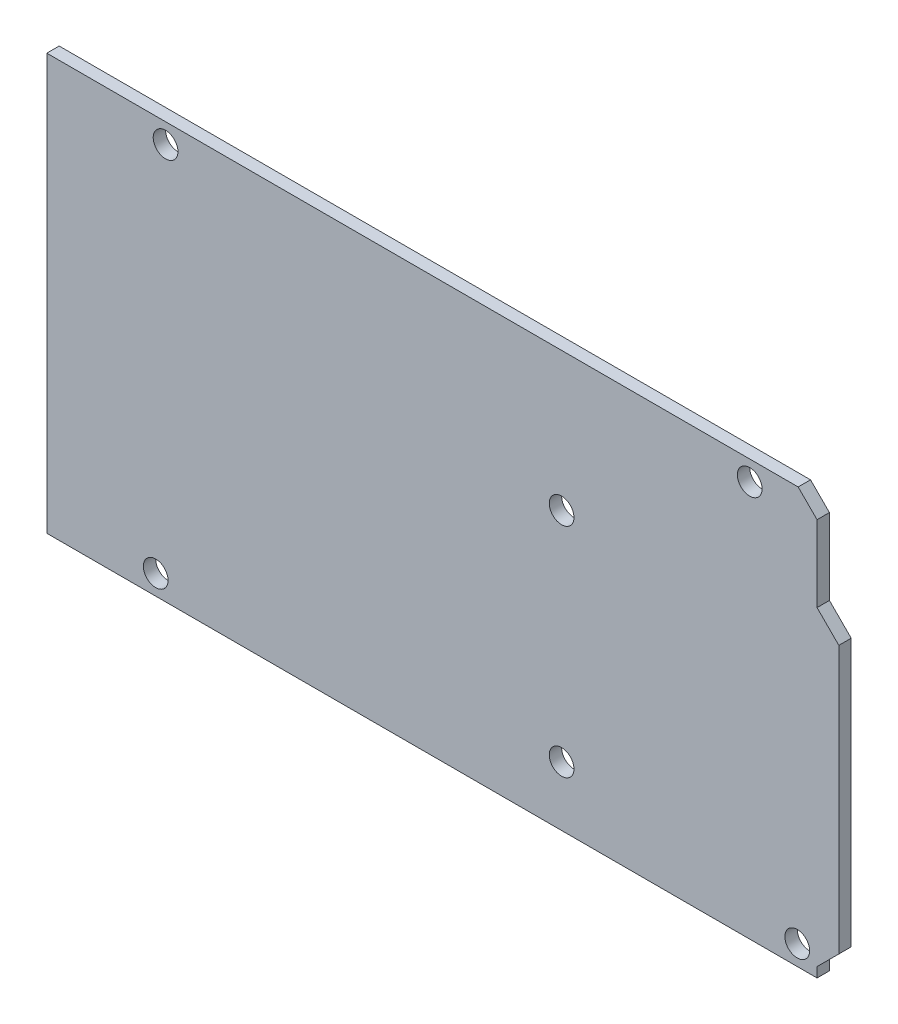
ISO-10303-21;
HEADER;
FILE_DESCRIPTION(('STEP AP214'),'2;1');
FILE_NAME('part.step','',(''),(''),'','','');
FILE_SCHEMA(('AUTOMOTIVE_DESIGN { 1 0 10303 214 1 1 1 1 }'));
ENDSEC;
DATA;
#1=APPLICATION_CONTEXT('core data for automotive mechanical design processes');
#2=APPLICATION_PROTOCOL_DEFINITION('international standard','automotive_design',2000,#1);
#3=PRODUCT_CONTEXT('',#1,'mechanical');
#4=PRODUCT('Part','Part','',(#3));
#5=PRODUCT_RELATED_PRODUCT_CATEGORY('part','',(#4));
#6=PRODUCT_DEFINITION_FORMATION('','',#4);
#7=PRODUCT_DEFINITION_CONTEXT('part definition',#1,'design');
#8=PRODUCT_DEFINITION('design','',#6,#7);
#9=PRODUCT_DEFINITION_SHAPE('','',#8);
#10=(LENGTH_UNIT() NAMED_UNIT(*) SI_UNIT(.MILLI.,.METRE.));
#11=(NAMED_UNIT(*) PLANE_ANGLE_UNIT() SI_UNIT($,.RADIAN.));
#12=(NAMED_UNIT(*) SI_UNIT($,.STERADIAN.) SOLID_ANGLE_UNIT());
#13=UNCERTAINTY_MEASURE_WITH_UNIT(LENGTH_MEASURE(1.E-05),#10,'distance_accuracy_value','');
#14=(GEOMETRIC_REPRESENTATION_CONTEXT(3) GLOBAL_UNCERTAINTY_ASSIGNED_CONTEXT((#13)) GLOBAL_UNIT_ASSIGNED_CONTEXT((#10,
#11,#12)) REPRESENTATION_CONTEXT('',''));
#15=CARTESIAN_POINT('',(0.,0.,0.));
#16=DIRECTION('',(0.,0.,1.));
#17=DIRECTION('',(1.,0.,0.));
#18=AXIS2_PLACEMENT_3D('',#15,#16,#17);
#19=CARTESIAN_POINT('',(69.9770000000001,69.9769999999999,1.5875));
#20=DIRECTION('',(0.707106781186548,0.707106781186547,0.));
#21=DIRECTION('',(-0.707106781186547,0.707106781186548,0.));
#22=AXIS2_PLACEMENT_3D('',#19,#20,#21);
#23=PLANE('',#22);
#24=DIRECTION('',(0.707106781186547,-0.707106781186548,0.));
#25=VECTOR('',#24,1.);
#26=CARTESIAN_POINT('',(69.9770000000001,69.9769999999999,0.));
#27=LINE('',#26,#25);
#28=CARTESIAN_POINT('',(98.806,41.148,0.));
#29=VERTEX_POINT('',#28);
#30=CARTESIAN_POINT('',(101.6,38.354,0.));
#31=VERTEX_POINT('',#30);
#32=EDGE_CURVE('E159',#29,#31,#27,.T.);
#33=ORIENTED_EDGE('',*,*,#32,.F.);
#34=DIRECTION('',(0.,0.,-1.));
#35=VECTOR('',#34,1.);
#36=CARTESIAN_POINT('',(98.806,41.148,1.5875));
#37=LINE('',#36,#35);
#38=CARTESIAN_POINT('',(98.806,41.148,1.5875));
#39=VERTEX_POINT('',#38);
#40=EDGE_CURVE('E11',#39,#29,#37,.T.);
#41=ORIENTED_EDGE('',*,*,#40,.F.);
#42=DIRECTION('',(0.707106781186547,-0.707106781186548,0.));
#43=VECTOR('',#42,1.);
#44=CARTESIAN_POINT('',(69.9770000000001,69.9769999999999,1.5875));
#45=LINE('',#44,#43);
#46=CARTESIAN_POINT('',(101.6,38.354,1.5875));
#47=VERTEX_POINT('',#46);
#48=EDGE_CURVE('E384',#39,#47,#45,.T.);
#49=ORIENTED_EDGE('',*,*,#48,.T.);
#50=DIRECTION('',(0.,0.,-1.));
#51=VECTOR('',#50,1.);
#52=CARTESIAN_POINT('',(101.6,38.354,1.5875));
#53=LINE('',#52,#51);
#54=EDGE_CURVE('E89',#47,#31,#53,.T.);
#55=ORIENTED_EDGE('',*,*,#54,.T.);
#56=EDGE_LOOP('',(#33,#41,#49,#55));
#57=FACE_BOUND('',#56,.T.);
#58=ADVANCED_FACE('F35',(#57),#23,.T.);
#59=CARTESIAN_POINT('',(98.8060000000001,1.40387248427893E-13,1.5875));
#60=DIRECTION('',(1.,0.,0.));
#61=DIRECTION('',(0.,1.,0.));
#62=AXIS2_PLACEMENT_3D('',#59,#60,#61);
#63=PLANE('',#62);
#64=DIRECTION('',(0.,-1.,0.));
#65=VECTOR('',#64,1.);
#66=CARTESIAN_POINT('',(98.8060000000001,1.40387248427893E-13,0.));
#67=LINE('',#66,#65);
#68=CARTESIAN_POINT('',(98.806,50.9153308473113,0.));
#69=VERTEX_POINT('',#68);
#70=EDGE_CURVE('E157',#69,#29,#67,.T.);
#71=ORIENTED_EDGE('',*,*,#70,.F.);
#72=DIRECTION('',(0.,0.,-1.));
#73=VECTOR('',#72,1.);
#74=CARTESIAN_POINT('',(98.806,50.9153308473113,1.5875));
#75=LINE('',#74,#73);
#76=CARTESIAN_POINT('',(98.806,50.9153308473113,1.5875));
#77=VERTEX_POINT('',#76);
#78=EDGE_CURVE('E44',#77,#69,#75,.T.);
#79=ORIENTED_EDGE('',*,*,#78,.F.);
#80=DIRECTION('',(0.,-1.,0.));
#81=VECTOR('',#80,1.);
#82=CARTESIAN_POINT('',(98.8060000000001,1.40387248427893E-13,1.5875));
#83=LINE('',#82,#81);
#84=EDGE_CURVE('E382',#77,#39,#83,.T.);
#85=ORIENTED_EDGE('',*,*,#84,.T.);
#86=ORIENTED_EDGE('',*,*,#40,.T.);
#87=EDGE_LOOP('',(#71,#79,#85,#86));
#88=FACE_BOUND('',#87,.T.);
#89=ADVANCED_FACE('F158',(#88),#63,.T.);
#90=CARTESIAN_POINT('',(74.8606654236561,74.8606654236554,1.5875));
#91=DIRECTION('',(0.707106781186551,0.707106781186544,0.));
#92=DIRECTION('',(-0.707106781186544,0.707106781186551,0.));
#93=AXIS2_PLACEMENT_3D('',#90,#91,#92);
#94=PLANE('',#93);
#95=DIRECTION('',(0.707106781186544,-0.707106781186551,0.));
#96=VECTOR('',#95,1.);
#97=CARTESIAN_POINT('',(74.8606654236561,74.8606654236554,0.));
#98=LINE('',#97,#96);
#99=CARTESIAN_POINT('',(96.3813308473113,53.34,0.));
#100=VERTEX_POINT('',#99);
#101=EDGE_CURVE('E149',#100,#69,#98,.T.);
#102=ORIENTED_EDGE('',*,*,#101,.F.);
#103=DIRECTION('',(0.,0.,-1.));
#104=VECTOR('',#103,1.);
#105=CARTESIAN_POINT('',(96.3813308473113,53.34,1.5875));
#106=LINE('',#105,#104);
#107=CARTESIAN_POINT('',(96.3813308473113,53.34,1.5875));
#108=VERTEX_POINT('',#107);
#109=EDGE_CURVE('E142',#108,#100,#106,.T.);
#110=ORIENTED_EDGE('',*,*,#109,.F.);
#111=DIRECTION('',(0.707106781186544,-0.707106781186551,0.));
#112=VECTOR('',#111,1.);
#113=CARTESIAN_POINT('',(74.8606654236561,74.8606654236554,1.5875));
#114=LINE('',#113,#112);
#115=EDGE_CURVE('E152',#108,#77,#114,.T.);
#116=ORIENTED_EDGE('',*,*,#115,.T.);
#117=ORIENTED_EDGE('',*,*,#78,.T.);
#118=EDGE_LOOP('',(#102,#110,#116,#117));
#119=FACE_BOUND('',#118,.T.);
#120=ADVANCED_FACE('F147',(#119),#94,.T.);
#121=CARTESIAN_POINT('',(0.,53.34,1.5875));
#122=DIRECTION('',(0.,1.,0.));
#123=DIRECTION('',(0.,0.,1.));
#124=AXIS2_PLACEMENT_3D('',#121,#122,#123);
#125=PLANE('',#124);
#126=DIRECTION('',(1.,0.,0.));
#127=VECTOR('',#126,1.);
#128=CARTESIAN_POINT('',(0.,53.34,0.));
#129=LINE('',#128,#127);
#130=CARTESIAN_POINT('',(0.,53.34,0.));
#131=VERTEX_POINT('',#130);
#132=EDGE_CURVE('E164',#131,#100,#129,.T.);
#133=ORIENTED_EDGE('',*,*,#132,.F.);
#134=DIRECTION('',(0.,0.,-1.));
#135=VECTOR('',#134,1.);
#136=CARTESIAN_POINT('',(0.,53.34,1.5875));
#137=LINE('',#136,#135);
#138=CARTESIAN_POINT('',(0.,53.34,1.5875));
#139=VERTEX_POINT('',#138);
#140=EDGE_CURVE('E140',#139,#131,#137,.T.);
#141=ORIENTED_EDGE('',*,*,#140,.F.);
#142=DIRECTION('',(1.,0.,0.));
#143=VECTOR('',#142,1.);
#144=CARTESIAN_POINT('',(0.,53.34,1.5875));
#145=LINE('',#144,#143);
#146=EDGE_CURVE('E376',#139,#108,#145,.T.);
#147=ORIENTED_EDGE('',*,*,#146,.T.);
#148=ORIENTED_EDGE('',*,*,#109,.T.);
#149=EDGE_LOOP('',(#133,#141,#147,#148));
#150=FACE_BOUND('',#149,.T.);
#151=ADVANCED_FACE('F269',(#150),#125,.T.);
#152=CARTESIAN_POINT('',(0.,0.,1.5875));
#153=DIRECTION('',(-1.,0.,0.));
#154=DIRECTION('',(0.,0.,1.));
#155=AXIS2_PLACEMENT_3D('',#152,#153,#154);
#156=PLANE('',#155);
#157=DIRECTION('',(0.,1.,0.));
#158=VECTOR('',#157,1.);
#159=CARTESIAN_POINT('',(0.,0.,0.));
#160=LINE('',#159,#158);
#161=CARTESIAN_POINT('',(0.,0.,0.));
#162=VERTEX_POINT('',#161);
#163=EDGE_CURVE('E166',#162,#131,#160,.T.);
#164=ORIENTED_EDGE('',*,*,#163,.F.);
#165=DIRECTION('',(0.,0.,-1.));
#166=VECTOR('',#165,1.);
#167=CARTESIAN_POINT('',(0.,0.,1.5875));
#168=LINE('',#167,#166);
#169=CARTESIAN_POINT('',(0.,0.,1.5875));
#170=VERTEX_POINT('',#169);
#171=EDGE_CURVE('E134',#170,#162,#168,.T.);
#172=ORIENTED_EDGE('',*,*,#171,.F.);
#173=DIRECTION('',(0.,1.,0.));
#174=VECTOR('',#173,1.);
#175=CARTESIAN_POINT('',(0.,0.,1.5875));
#176=LINE('',#175,#174);
#177=EDGE_CURVE('E375',#170,#139,#176,.T.);
#178=ORIENTED_EDGE('',*,*,#177,.T.);
#179=ORIENTED_EDGE('',*,*,#140,.T.);
#180=EDGE_LOOP('',(#164,#172,#178,#179));
#181=FACE_BOUND('',#180,.T.);
#182=ADVANCED_FACE('F265',(#181),#156,.T.);
#183=CARTESIAN_POINT('',(0.,0.,1.5875));
#184=DIRECTION('',(0.,1.,0.));
#185=DIRECTION('',(0.,0.,1.));
#186=AXIS2_PLACEMENT_3D('',#183,#184,#185);
#187=PLANE('',#186);
#188=DIRECTION('',(1.,0.,0.));
#189=VECTOR('',#188,1.);
#190=CARTESIAN_POINT('',(0.,0.,0.));
#191=LINE('',#190,#189);
#192=CARTESIAN_POINT('',(98.806,0.,0.));
#193=VERTEX_POINT('',#192);
#194=EDGE_CURVE('E171',#162,#193,#191,.T.);
#195=ORIENTED_EDGE('',*,*,#194,.T.);
#196=DIRECTION('',(0.,0.,-1.));
#197=VECTOR('',#196,1.);
#198=CARTESIAN_POINT('',(98.806,0.,1.5875));
#199=LINE('',#198,#197);
#200=CARTESIAN_POINT('',(98.806,0.,1.5875));
#201=VERTEX_POINT('',#200);
#202=EDGE_CURVE('E132',#201,#193,#199,.T.);
#203=ORIENTED_EDGE('',*,*,#202,.F.);
#204=DIRECTION('',(1.,0.,0.));
#205=VECTOR('',#204,1.);
#206=CARTESIAN_POINT('',(0.,0.,1.5875));
#207=LINE('',#206,#205);
#208=EDGE_CURVE('E125',#170,#201,#207,.T.);
#209=ORIENTED_EDGE('',*,*,#208,.F.);
#210=ORIENTED_EDGE('',*,*,#171,.T.);
#211=EDGE_LOOP('',(#195,#203,#209,#210));
#212=FACE_BOUND('',#211,.T.);
#213=ADVANCED_FACE('F262',(#212),#187,.F.);
#214=CARTESIAN_POINT('',(98.806,0.,1.5875));
#215=DIRECTION('',(-1.,0.,0.));
#216=DIRECTION('',(0.,0.,1.));
#217=AXIS2_PLACEMENT_3D('',#214,#215,#216);
#218=PLANE('',#217);
#219=DIRECTION('',(0.,1.,0.));
#220=VECTOR('',#219,1.);
#221=CARTESIAN_POINT('',(98.806,0.,0.));
#222=LINE('',#221,#220);
#223=CARTESIAN_POINT('',(98.806,1.27,0.));
#224=VERTEX_POINT('',#223);
#225=EDGE_CURVE('E131',#193,#224,#222,.T.);
#226=ORIENTED_EDGE('',*,*,#225,.T.);
#227=DIRECTION('',(0.,0.,-1.));
#228=VECTOR('',#227,1.);
#229=CARTESIAN_POINT('',(98.806,1.27,1.5875));
#230=LINE('',#229,#228);
#231=CARTESIAN_POINT('',(98.806,1.27,1.5875));
#232=VERTEX_POINT('',#231);
#233=EDGE_CURVE('E116',#232,#224,#230,.T.);
#234=ORIENTED_EDGE('',*,*,#233,.F.);
#235=DIRECTION('',(0.,1.,0.));
#236=VECTOR('',#235,1.);
#237=CARTESIAN_POINT('',(98.806,0.,1.5875));
#238=LINE('',#237,#236);
#239=EDGE_CURVE('E119',#201,#232,#238,.T.);
#240=ORIENTED_EDGE('',*,*,#239,.F.);
#241=ORIENTED_EDGE('',*,*,#202,.T.);
#242=EDGE_LOOP('',(#226,#234,#240,#241));
#243=FACE_BOUND('',#242,.T.);
#244=ADVANCED_FACE('F130',(#243),#218,.F.);
#245=CARTESIAN_POINT('',(48.7679999999998,-48.768,1.5875));
#246=DIRECTION('',(-0.707106781186546,0.707106781186549,0.));
#247=DIRECTION('',(-0.707106781186549,-0.707106781186546,0.));
#248=AXIS2_PLACEMENT_3D('',#245,#246,#247);
#249=PLANE('',#248);
#250=DIRECTION('',(0.707106781186549,0.707106781186546,0.));
#251=VECTOR('',#250,1.);
#252=CARTESIAN_POINT('',(48.7679999999998,-48.768,0.));
#253=LINE('',#252,#251);
#254=CARTESIAN_POINT('',(101.6,4.06399999999999,0.));
#255=VERTEX_POINT('',#254);
#256=EDGE_CURVE('E175',#224,#255,#253,.T.);
#257=ORIENTED_EDGE('',*,*,#256,.T.);
#258=DIRECTION('',(0.,0.,-1.));
#259=VECTOR('',#258,1.);
#260=CARTESIAN_POINT('',(101.6,4.06399999999999,1.5875));
#261=LINE('',#260,#259);
#262=CARTESIAN_POINT('',(101.6,4.06399999999999,1.5875));
#263=VERTEX_POINT('',#262);
#264=EDGE_CURVE('E118',#263,#255,#261,.T.);
#265=ORIENTED_EDGE('',*,*,#264,.F.);
#266=DIRECTION('',(0.707106781186549,0.707106781186546,0.));
#267=VECTOR('',#266,1.);
#268=CARTESIAN_POINT('',(48.7679999999998,-48.768,1.5875));
#269=LINE('',#268,#267);
#270=EDGE_CURVE('E111',#232,#263,#269,.T.);
#271=ORIENTED_EDGE('',*,*,#270,.F.);
#272=ORIENTED_EDGE('',*,*,#233,.T.);
#273=EDGE_LOOP('',(#257,#265,#271,#272));
#274=FACE_BOUND('',#273,.T.);
#275=ADVANCED_FACE('F114',(#274),#249,.F.);
#276=CARTESIAN_POINT('',(15.24,50.8,1.5875));
#277=DIRECTION('',(0.,0.,-1.));
#278=DIRECTION('',(-1.,0.,0.));
#279=AXIS2_PLACEMENT_3D('',#276,#277,#278);
#280=CYLINDRICAL_SURFACE('',#279,1.5875);
#281=CARTESIAN_POINT('',(15.24,50.8,1.5875));
#282=DIRECTION('',(0.,0.,1.));
#283=DIRECTION('',(1.,0.,0.));
#284=AXIS2_PLACEMENT_3D('',#281,#282,#283);
#285=CIRCLE('',#284,1.5875);
#286=CARTESIAN_POINT('',(16.8275,50.8,1.5875));
#287=VERTEX_POINT('',#286);
#288=EDGE_CURVE('E386',#287,#287,#285,.T.);
#289=ORIENTED_EDGE('',*,*,#288,.T.);
#290=EDGE_LOOP('',(#289));
#291=FACE_BOUND('',#290,.T.);
#292=CARTESIAN_POINT('',(15.24,50.8,0.));
#293=DIRECTION('',(0.,0.,1.));
#294=DIRECTION('',(1.,0.,0.));
#295=AXIS2_PLACEMENT_3D('',#292,#293,#294);
#296=CIRCLE('',#295,1.5875);
#297=CARTESIAN_POINT('',(16.8275,50.8,0.));
#298=VERTEX_POINT('',#297);
#299=EDGE_CURVE('E195',#298,#298,#296,.T.);
#300=ORIENTED_EDGE('',*,*,#299,.F.);
#301=EDGE_LOOP('',(#300));
#302=FACE_BOUND('',#301,.T.);
#303=ADVANCED_FACE('F205',(#291,#302),#280,.F.);
#304=CARTESIAN_POINT('',(13.97,2.54,1.5875));
#305=DIRECTION('',(0.,0.,-1.));
#306=DIRECTION('',(-1.,0.,0.));
#307=AXIS2_PLACEMENT_3D('',#304,#305,#306);
#308=CYLINDRICAL_SURFACE('',#307,1.5875);
#309=CARTESIAN_POINT('',(13.97,2.54,1.5875));
#310=DIRECTION('',(0.,0.,1.));
#311=DIRECTION('',(1.,0.,0.));
#312=AXIS2_PLACEMENT_3D('',#309,#310,#311);
#313=CIRCLE('',#312,1.5875);
#314=CARTESIAN_POINT('',(15.5575,2.54,1.5875));
#315=VERTEX_POINT('',#314);
#316=EDGE_CURVE('E389',#315,#315,#313,.T.);
#317=ORIENTED_EDGE('',*,*,#316,.T.);
#318=EDGE_LOOP('',(#317));
#319=FACE_BOUND('',#318,.T.);
#320=CARTESIAN_POINT('',(13.97,2.54,0.));
#321=DIRECTION('',(0.,0.,1.));
#322=DIRECTION('',(1.,0.,0.));
#323=AXIS2_PLACEMENT_3D('',#320,#321,#322);
#324=CIRCLE('',#323,1.5875);
#325=CARTESIAN_POINT('',(15.5575,2.54,0.));
#326=VERTEX_POINT('',#325);
#327=EDGE_CURVE('E192',#326,#326,#324,.T.);
#328=ORIENTED_EDGE('',*,*,#327,.F.);
#329=EDGE_LOOP('',(#328));
#330=FACE_BOUND('',#329,.T.);
#331=ADVANCED_FACE('F208',(#319,#330),#308,.F.);
#332=CARTESIAN_POINT('',(90.17,50.8,1.5875));
#333=DIRECTION('',(0.,0.,-1.));
#334=DIRECTION('',(-1.,0.,0.));
#335=AXIS2_PLACEMENT_3D('',#332,#333,#334);
#336=CYLINDRICAL_SURFACE('',#335,1.5875);
#337=CARTESIAN_POINT('',(90.17,50.8,1.5875));
#338=DIRECTION('',(0.,0.,1.));
#339=DIRECTION('',(1.,0.,0.));
#340=AXIS2_PLACEMENT_3D('',#337,#338,#339);
#341=CIRCLE('',#340,1.5875);
#342=CARTESIAN_POINT('',(91.7575,50.8,1.5875));
#343=VERTEX_POINT('',#342);
#344=EDGE_CURVE('E392',#343,#343,#341,.T.);
#345=ORIENTED_EDGE('',*,*,#344,.T.);
#346=EDGE_LOOP('',(#345));
#347=FACE_BOUND('',#346,.T.);
#348=CARTESIAN_POINT('',(90.17,50.8,0.));
#349=DIRECTION('',(0.,0.,1.));
#350=DIRECTION('',(1.,0.,0.));
#351=AXIS2_PLACEMENT_3D('',#348,#349,#350);
#352=CIRCLE('',#351,1.5875);
#353=CARTESIAN_POINT('',(91.7575,50.8,0.));
#354=VERTEX_POINT('',#353);
#355=EDGE_CURVE('E189',#354,#354,#352,.T.);
#356=ORIENTED_EDGE('',*,*,#355,.F.);
#357=EDGE_LOOP('',(#356));
#358=FACE_BOUND('',#357,.T.);
#359=ADVANCED_FACE('F212',(#347,#358),#336,.F.);
#360=CARTESIAN_POINT('',(96.266,2.54,1.5875));
#361=DIRECTION('',(0.,0.,-1.));
#362=DIRECTION('',(-1.,0.,0.));
#363=AXIS2_PLACEMENT_3D('',#360,#361,#362);
#364=CYLINDRICAL_SURFACE('',#363,1.5875);
#365=CARTESIAN_POINT('',(96.266,2.54,1.5875));
#366=DIRECTION('',(0.,0.,1.));
#367=DIRECTION('',(1.,0.,0.));
#368=AXIS2_PLACEMENT_3D('',#365,#366,#367);
#369=CIRCLE('',#368,1.5875);
#370=CARTESIAN_POINT('',(97.8535,2.54,1.5875));
#371=VERTEX_POINT('',#370);
#372=EDGE_CURVE('E395',#371,#371,#369,.T.);
#373=ORIENTED_EDGE('',*,*,#372,.T.);
#374=EDGE_LOOP('',(#373));
#375=FACE_BOUND('',#374,.T.);
#376=CARTESIAN_POINT('',(96.266,2.54,0.));
#377=DIRECTION('',(0.,0.,1.));
#378=DIRECTION('',(1.,0.,0.));
#379=AXIS2_PLACEMENT_3D('',#376,#377,#378);
#380=CIRCLE('',#379,1.5875);
#381=CARTESIAN_POINT('',(97.8535,2.54,0.));
#382=VERTEX_POINT('',#381);
#383=EDGE_CURVE('E186',#382,#382,#380,.T.);
#384=ORIENTED_EDGE('',*,*,#383,.F.);
#385=EDGE_LOOP('',(#384));
#386=FACE_BOUND('',#385,.T.);
#387=ADVANCED_FACE('F216',(#375,#386),#364,.F.);
#388=CARTESIAN_POINT('',(66.04,35.56,1.5875));
#389=DIRECTION('',(0.,0.,-1.));
#390=DIRECTION('',(-1.,0.,0.));
#391=AXIS2_PLACEMENT_3D('',#388,#389,#390);
#392=CYLINDRICAL_SURFACE('',#391,1.5875);
#393=CARTESIAN_POINT('',(66.04,35.56,1.5875));
#394=DIRECTION('',(0.,0.,1.));
#395=DIRECTION('',(1.,0.,0.));
#396=AXIS2_PLACEMENT_3D('',#393,#394,#395);
#397=CIRCLE('',#396,1.5875);
#398=CARTESIAN_POINT('',(67.6275,35.56,1.5875));
#399=VERTEX_POINT('',#398);
#400=EDGE_CURVE('E231',#399,#399,#397,.T.);
#401=ORIENTED_EDGE('',*,*,#400,.T.);
#402=EDGE_LOOP('',(#401));
#403=FACE_BOUND('',#402,.T.);
#404=CARTESIAN_POINT('',(66.04,35.56,0.));
#405=DIRECTION('',(0.,0.,1.));
#406=DIRECTION('',(1.,0.,0.));
#407=AXIS2_PLACEMENT_3D('',#404,#405,#406);
#408=CIRCLE('',#407,1.5875);
#409=CARTESIAN_POINT('',(67.6275,35.56,0.));
#410=VERTEX_POINT('',#409);
#411=EDGE_CURVE('E183',#410,#410,#408,.T.);
#412=ORIENTED_EDGE('',*,*,#411,.F.);
#413=EDGE_LOOP('',(#412));
#414=FACE_BOUND('',#413,.T.);
#415=ADVANCED_FACE('F219',(#403,#414),#392,.F.);
#416=CARTESIAN_POINT('',(66.04,7.62,1.5875));
#417=DIRECTION('',(0.,0.,-1.));
#418=DIRECTION('',(-1.,0.,0.));
#419=AXIS2_PLACEMENT_3D('',#416,#417,#418);
#420=CYLINDRICAL_SURFACE('',#419,1.5875);
#421=CARTESIAN_POINT('',(66.04,7.62,1.5875));
#422=DIRECTION('',(0.,0.,1.));
#423=DIRECTION('',(1.,0.,0.));
#424=AXIS2_PLACEMENT_3D('',#421,#422,#423);
#425=CIRCLE('',#424,1.5875);
#426=CARTESIAN_POINT('',(67.6275,7.62,1.5875));
#427=VERTEX_POINT('',#426);
#428=EDGE_CURVE('E177',#427,#427,#425,.T.);
#429=ORIENTED_EDGE('',*,*,#428,.T.);
#430=EDGE_LOOP('',(#429));
#431=FACE_BOUND('',#430,.T.);
#432=CARTESIAN_POINT('',(66.04,7.62,0.));
#433=DIRECTION('',(0.,0.,1.));
#434=DIRECTION('',(1.,0.,0.));
#435=AXIS2_PLACEMENT_3D('',#432,#433,#434);
#436=CIRCLE('',#435,1.5875);
#437=CARTESIAN_POINT('',(67.6275,7.62,0.));
#438=VERTEX_POINT('',#437);
#439=EDGE_CURVE('E180',#438,#438,#436,.T.);
#440=ORIENTED_EDGE('',*,*,#439,.F.);
#441=EDGE_LOOP('',(#440));
#442=FACE_BOUND('',#441,.T.);
#443=ADVANCED_FACE('F37',(#431,#442),#420,.F.);
#444=CARTESIAN_POINT('',(101.6,0.,1.5875));
#445=DIRECTION('',(-1.,0.,0.));
#446=DIRECTION('',(0.,0.,1.));
#447=AXIS2_PLACEMENT_3D('',#444,#445,#446);
#448=PLANE('',#447);
#449=DIRECTION('',(0.,1.,0.));
#450=VECTOR('',#449,1.);
#451=CARTESIAN_POINT('',(101.6,0.,0.));
#452=LINE('',#451,#450);
#453=EDGE_CURVE('E82',#255,#31,#452,.T.);
#454=ORIENTED_EDGE('',*,*,#453,.T.);
#455=ORIENTED_EDGE('',*,*,#54,.F.);
#456=DIRECTION('',(0.,1.,0.));
#457=VECTOR('',#456,1.);
#458=CARTESIAN_POINT('',(101.6,0.,1.5875));
#459=LINE('',#458,#457);
#460=EDGE_CURVE('E52',#263,#47,#459,.T.);
#461=ORIENTED_EDGE('',*,*,#460,.F.);
#462=ORIENTED_EDGE('',*,*,#264,.T.);
#463=EDGE_LOOP('',(#454,#455,#461,#462));
#464=FACE_BOUND('',#463,.T.);
#465=ADVANCED_FACE('F226',(#464),#448,.F.);
#466=CARTESIAN_POINT('',(0.,0.,1.5875));
#467=DIRECTION('',(0.,0.,1.));
#468=DIRECTION('',(1.,0.,0.));
#469=AXIS2_PLACEMENT_3D('',#466,#467,#468);
#470=PLANE('',#469);
#471=ORIENTED_EDGE('',*,*,#428,.F.);
#472=EDGE_LOOP('',(#471));
#473=FACE_BOUND('',#472,.T.);
#474=ORIENTED_EDGE('',*,*,#400,.F.);
#475=EDGE_LOOP('',(#474));
#476=FACE_BOUND('',#475,.T.);
#477=ORIENTED_EDGE('',*,*,#372,.F.);
#478=EDGE_LOOP('',(#477));
#479=FACE_BOUND('',#478,.T.);
#480=ORIENTED_EDGE('',*,*,#344,.F.);
#481=EDGE_LOOP('',(#480));
#482=FACE_BOUND('',#481,.T.);
#483=ORIENTED_EDGE('',*,*,#316,.F.);
#484=EDGE_LOOP('',(#483));
#485=FACE_BOUND('',#484,.T.);
#486=ORIENTED_EDGE('',*,*,#288,.F.);
#487=EDGE_LOOP('',(#486));
#488=FACE_BOUND('',#487,.T.);
#489=ORIENTED_EDGE('',*,*,#48,.F.);
#490=ORIENTED_EDGE('',*,*,#84,.F.);
#491=ORIENTED_EDGE('',*,*,#115,.F.);
#492=ORIENTED_EDGE('',*,*,#146,.F.);
#493=ORIENTED_EDGE('',*,*,#177,.F.);
#494=ORIENTED_EDGE('',*,*,#208,.T.);
#495=ORIENTED_EDGE('',*,*,#239,.T.);
#496=ORIENTED_EDGE('',*,*,#270,.T.);
#497=ORIENTED_EDGE('',*,*,#460,.T.);
#498=EDGE_LOOP('',(#489,#490,#491,#492,#493,#494,#495,#496,#497));
#499=FACE_BOUND('',#498,.T.);
#500=ADVANCED_FACE('F122',(#473,#476,#479,#482,#485,#488,#499),#470,.T.);
#501=CARTESIAN_POINT('',(0.,0.,0.));
#502=DIRECTION('',(0.,0.,1.));
#503=DIRECTION('',(1.,0.,0.));
#504=AXIS2_PLACEMENT_3D('',#501,#502,#503);
#505=PLANE('',#504);
#506=ORIENTED_EDGE('',*,*,#439,.T.);
#507=EDGE_LOOP('',(#506));
#508=FACE_BOUND('',#507,.T.);
#509=ORIENTED_EDGE('',*,*,#411,.T.);
#510=EDGE_LOOP('',(#509));
#511=FACE_BOUND('',#510,.T.);
#512=ORIENTED_EDGE('',*,*,#383,.T.);
#513=EDGE_LOOP('',(#512));
#514=FACE_BOUND('',#513,.T.);
#515=ORIENTED_EDGE('',*,*,#355,.T.);
#516=EDGE_LOOP('',(#515));
#517=FACE_BOUND('',#516,.T.);
#518=ORIENTED_EDGE('',*,*,#327,.T.);
#519=EDGE_LOOP('',(#518));
#520=FACE_BOUND('',#519,.T.);
#521=ORIENTED_EDGE('',*,*,#299,.T.);
#522=EDGE_LOOP('',(#521));
#523=FACE_BOUND('',#522,.T.);
#524=ORIENTED_EDGE('',*,*,#32,.T.);
#525=ORIENTED_EDGE('',*,*,#453,.F.);
#526=ORIENTED_EDGE('',*,*,#256,.F.);
#527=ORIENTED_EDGE('',*,*,#225,.F.);
#528=ORIENTED_EDGE('',*,*,#194,.F.);
#529=ORIENTED_EDGE('',*,*,#163,.T.);
#530=ORIENTED_EDGE('',*,*,#132,.T.);
#531=ORIENTED_EDGE('',*,*,#101,.T.);
#532=ORIENTED_EDGE('',*,*,#70,.T.);
#533=EDGE_LOOP('',(#524,#525,#526,#527,#528,#529,#530,#531,#532));
#534=FACE_BOUND('',#533,.T.);
#535=ADVANCED_FACE('F161',(#508,#511,#514,#517,#520,#523,#534),#505,.F.);
#536=CLOSED_SHELL('',(#58,#89,#120,#151,#182,#213,#244,#275,#303,#331,#359,#387,#415,#443,#465,
#500,#535));
#537=MANIFOLD_SOLID_BREP('B2',#536);
#538=ADVANCED_BREP_SHAPE_REPRESENTATION('',(#18,#537),#14);
#539=SHAPE_DEFINITION_REPRESENTATION(#9,#538);
ENDSEC;
END-ISO-10303-21;
